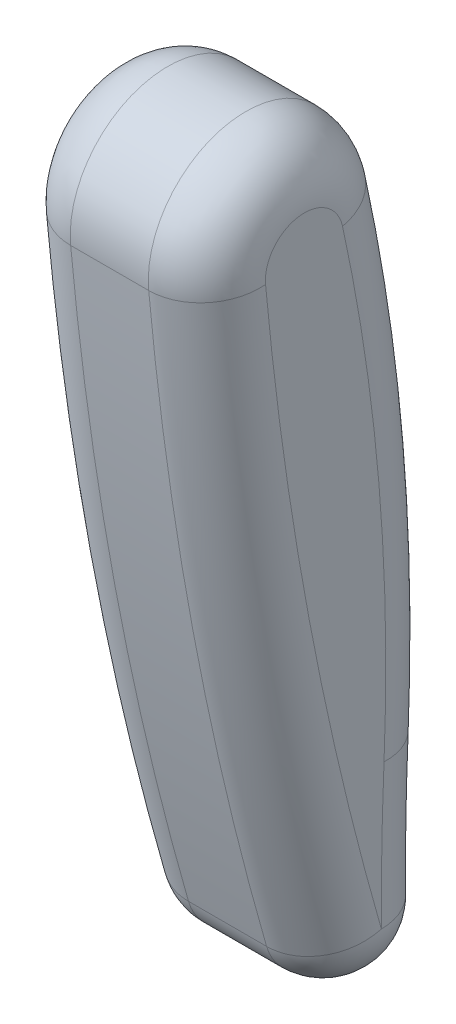
ISO-10303-21;
HEADER;
FILE_DESCRIPTION(('STEP AP214'),'2;1');
FILE_NAME('part.step','',(''),(''),'','','');
FILE_SCHEMA(('AUTOMOTIVE_DESIGN { 1 0 10303 214 1 1 1 1 }'));
ENDSEC;
DATA;
#1=APPLICATION_CONTEXT('core data for automotive mechanical design processes');
#2=APPLICATION_PROTOCOL_DEFINITION('international standard','automotive_design',2000,#1);
#3=PRODUCT_CONTEXT('',#1,'mechanical');
#4=PRODUCT('Part','Part','',(#3));
#5=PRODUCT_RELATED_PRODUCT_CATEGORY('part','',(#4));
#6=PRODUCT_DEFINITION_FORMATION('','',#4);
#7=PRODUCT_DEFINITION_CONTEXT('part definition',#1,'design');
#8=PRODUCT_DEFINITION('design','',#6,#7);
#9=PRODUCT_DEFINITION_SHAPE('','',#8);
#10=(LENGTH_UNIT() NAMED_UNIT(*) SI_UNIT(.MILLI.,.METRE.));
#11=(NAMED_UNIT(*) PLANE_ANGLE_UNIT() SI_UNIT($,.RADIAN.));
#12=(NAMED_UNIT(*) SI_UNIT($,.STERADIAN.) SOLID_ANGLE_UNIT());
#13=UNCERTAINTY_MEASURE_WITH_UNIT(LENGTH_MEASURE(1.E-05),#10,'distance_accuracy_value','');
#14=(GEOMETRIC_REPRESENTATION_CONTEXT(3) GLOBAL_UNCERTAINTY_ASSIGNED_CONTEXT((#13)) GLOBAL_UNIT_ASSIGNED_CONTEXT((#10,
#11,#12)) REPRESENTATION_CONTEXT('',''));
#15=CARTESIAN_POINT('',(0.,0.,0.));
#16=DIRECTION('',(0.,0.,1.));
#17=DIRECTION('',(1.,0.,0.));
#18=AXIS2_PLACEMENT_3D('',#15,#16,#17);
#19=CARTESIAN_POINT('',(177.8,-559.10903574724,-2113.11328138226));
#20=DIRECTION('',(-1.,0.,0.));
#21=DIRECTION('',(0.,0.,1.));
#22=AXIS2_PLACEMENT_3D('',#19,#20,#21);
#23=CYLINDRICAL_SURFACE('',#22,2209.8);
#24=DIRECTION('',(-1.,0.,0.));
#25=VECTOR('',#24,1.);
#26=CARTESIAN_POINT('',(177.8,-761.528986098875,87.3962513622892));
#27=LINE('',#26,#25);
#28=CARTESIAN_POINT('',(139.7,-761.528986098875,87.3962513622892));
#29=VERTEX_POINT('',#28);
#30=CARTESIAN_POINT('',(88.9,-761.528986098875,87.3962513622892));
#31=VERTEX_POINT('',#30);
#32=EDGE_CURVE('E182',#29,#31,#27,.T.);
#33=ORIENTED_EDGE('',*,*,#32,.T.);
#34=CARTESIAN_POINT('',(88.9,-559.10903574724,-2113.11328138226));
#35=DIRECTION('',(-1.,0.,0.));
#36=DIRECTION('',(0.,0.,1.));
#37=AXIS2_PLACEMENT_3D('',#34,#35,#36);
#38=CIRCLE('',#37,2209.8);
#39=CARTESIAN_POINT('',(88.9,-1169.53967872684,10.7017929854443));
#40=VERTEX_POINT('',#39);
#41=EDGE_CURVE('E163',#31,#40,#38,.F.);
#42=ORIENTED_EDGE('',*,*,#41,.T.);
#43=DIRECTION('',(-1.,0.,0.));
#44=VECTOR('',#43,1.);
#45=CARTESIAN_POINT('',(177.8,-1169.53967872684,10.7017929854443));
#46=LINE('',#45,#44);
#47=CARTESIAN_POINT('',(139.7,-1169.53967872684,10.7017929854443));
#48=VERTEX_POINT('',#47);
#49=EDGE_CURVE('E127',#48,#40,#46,.T.);
#50=ORIENTED_EDGE('',*,*,#49,.F.);
#51=CARTESIAN_POINT('',(139.7,-559.10903574724,-2113.11328138226));
#52=DIRECTION('',(-1.,0.,0.));
#53=DIRECTION('',(0.,0.,1.));
#54=AXIS2_PLACEMENT_3D('',#51,#52,#53);
#55=CIRCLE('',#54,2209.8);
#56=EDGE_CURVE('E161',#48,#29,#55,.T.);
#57=ORIENTED_EDGE('',*,*,#56,.T.);
#58=EDGE_LOOP('',(#33,#42,#50,#57));
#59=FACE_BOUND('',#58,.T.);
#60=ADVANCED_FACE('F35',(#59),#23,.T.);
#61=CARTESIAN_POINT('',(177.8,-1159.01501246857,-25.9157082967632));
#62=DIRECTION('',(-1.,0.,0.));
#63=DIRECTION('',(0.,0.,1.));
#64=AXIS2_PLACEMENT_3D('',#61,#62,#63);
#65=CYLINDRICAL_SURFACE('',#64,38.100000000006);
#66=ORIENTED_EDGE('',*,*,#49,.T.);
#67=CARTESIAN_POINT('',(88.9,-1159.01501246857,-25.9157082967632));
#68=DIRECTION('',(-1.,0.,0.));
#69=DIRECTION('',(0.,0.,1.));
#70=AXIS2_PLACEMENT_3D('',#67,#68,#69);
#71=CIRCLE('',#70,38.100000000006);
#72=CARTESIAN_POINT('',(88.9,-1158.77775860236,-64.01496958361));
#73=VERTEX_POINT('',#72);
#74=EDGE_CURVE('E117',#40,#73,#71,.F.);
#75=ORIENTED_EDGE('',*,*,#74,.T.);
#76=DIRECTION('',(-1.,0.,0.));
#77=VECTOR('',#76,1.);
#78=CARTESIAN_POINT('',(177.8,-1158.77775860236,-64.01496958361));
#79=LINE('',#78,#77);
#80=CARTESIAN_POINT('',(139.7,-1158.77775860236,-64.01496958361));
#81=VERTEX_POINT('',#80);
#82=EDGE_CURVE('E110',#81,#73,#79,.T.);
#83=ORIENTED_EDGE('',*,*,#82,.F.);
#84=CARTESIAN_POINT('',(139.7,-1159.01501246857,-25.9157082967632));
#85=DIRECTION('',(-1.,0.,0.));
#86=DIRECTION('',(0.,0.,1.));
#87=AXIS2_PLACEMENT_3D('',#84,#85,#86);
#88=CIRCLE('',#87,38.100000000006);
#89=EDGE_CURVE('E124',#81,#48,#88,.T.);
#90=ORIENTED_EDGE('',*,*,#89,.T.);
#91=EDGE_LOOP('',(#66,#75,#83,#90));
#92=FACE_BOUND('',#91,.T.);
#93=ADVANCED_FACE('F122',(#92),#65,.T.);
#94=CARTESIAN_POINT('',(177.8,-1147.29470222544,-1908.01427826088));
#95=DIRECTION('',(-1.,0.,0.));
#96=DIRECTION('',(0.,0.,1.));
#97=AXIS2_PLACEMENT_3D('',#94,#95,#96);
#98=CYLINDRICAL_SURFACE('',#97,1844.03506229844);
#99=ORIENTED_EDGE('',*,*,#82,.T.);
#100=CARTESIAN_POINT('',(88.9,-1147.29470222544,-1908.01427826088));
#101=DIRECTION('',(-1.,0.,0.));
#102=DIRECTION('',(0.,0.,1.));
#103=AXIS2_PLACEMENT_3D('',#100,#101,#102);
#104=CIRCLE('',#103,1844.03506229844);
#105=CARTESIAN_POINT('',(88.9,-1067.28642691419,-65.7157175309082));
#106=VERTEX_POINT('',#105);
#107=EDGE_CURVE('E116',#73,#106,#104,.T.);
#108=ORIENTED_EDGE('',*,*,#107,.T.);
#109=DIRECTION('',(-1.,0.,0.));
#110=VECTOR('',#109,1.);
#111=CARTESIAN_POINT('',(177.8,-1067.28642691419,-65.7157175309082));
#112=LINE('',#111,#110);
#113=CARTESIAN_POINT('',(139.7,-1067.28642691419,-65.7157175309082));
#114=VERTEX_POINT('',#113);
#115=EDGE_CURVE('E112',#114,#106,#112,.T.);
#116=ORIENTED_EDGE('',*,*,#115,.F.);
#117=CARTESIAN_POINT('',(139.7,-1147.29470222544,-1908.01427826088));
#118=DIRECTION('',(-1.,0.,0.));
#119=DIRECTION('',(0.,0.,1.));
#120=AXIS2_PLACEMENT_3D('',#117,#118,#119);
#121=CIRCLE('',#120,1844.03506229844);
#122=EDGE_CURVE('E107',#114,#81,#121,.F.);
#123=ORIENTED_EDGE('',*,*,#122,.T.);
#124=EDGE_LOOP('',(#99,#108,#116,#123));
#125=FACE_BOUND('',#124,.T.);
#126=ADVANCED_FACE('F109',(#125),#98,.F.);
#127=CARTESIAN_POINT('',(177.8,-1012.18416138642,1203.08834154745));
#128=DIRECTION('',(-1.,0.,0.));
#129=DIRECTION('',(0.,0.,1.));
#130=AXIS2_PLACEMENT_3D('',#127,#128,#129);
#131=CYLINDRICAL_SURFACE('',#130,1270.);
#132=ORIENTED_EDGE('',*,*,#115,.T.);
#133=CARTESIAN_POINT('',(88.9,-1012.18416138642,1203.08834154745));
#134=DIRECTION('',(-1.,0.,0.));
#135=DIRECTION('',(0.,0.,1.));
#136=AXIS2_PLACEMENT_3D('',#133,#134,#135);
#137=CIRCLE('',#136,1270.);
#138=CARTESIAN_POINT('',(88.9,-742.213802936383,-37.8854718581223));
#139=VERTEX_POINT('',#138);
#140=EDGE_CURVE('E154',#106,#139,#137,.F.);
#141=ORIENTED_EDGE('',*,*,#140,.T.);
#142=DIRECTION('',(-1.,0.,0.));
#143=VECTOR('',#142,1.);
#144=CARTESIAN_POINT('',(177.8,-742.213802936383,-37.8854718581223));
#145=LINE('',#144,#143);
#146=CARTESIAN_POINT('',(139.7,-742.213802936383,-37.8854718581223));
#147=VERTEX_POINT('',#146);
#148=EDGE_CURVE('E208',#147,#139,#145,.T.);
#149=ORIENTED_EDGE('',*,*,#148,.F.);
#150=CARTESIAN_POINT('',(139.7,-1012.18416138642,1203.08834154745));
#151=DIRECTION('',(-1.,0.,0.));
#152=DIRECTION('',(0.,0.,1.));
#153=AXIS2_PLACEMENT_3D('',#150,#151,#152);
#154=CIRCLE('',#153,1270.);
#155=EDGE_CURVE('E152',#147,#114,#154,.T.);
#156=ORIENTED_EDGE('',*,*,#155,.T.);
#157=EDGE_LOOP('',(#132,#141,#149,#156));
#158=FACE_BOUND('',#157,.T.);
#159=ADVANCED_FACE('F214',(#158),#131,.T.);
#160=CARTESIAN_POINT('',(177.8,-755.712320858886,24.1632188121575));
#161=DIRECTION('',(-1.,0.,0.));
#162=DIRECTION('',(0.,0.,1.));
#163=AXIS2_PLACEMENT_3D('',#160,#161,#162);
#164=CYLINDRICAL_SURFACE('',#163,63.5000000000009);
#165=ORIENTED_EDGE('',*,*,#148,.T.);
#166=CARTESIAN_POINT('',(88.9,-755.712320858886,24.1632188121575));
#167=DIRECTION('',(-1.,0.,0.));
#168=DIRECTION('',(0.,0.,1.));
#169=AXIS2_PLACEMENT_3D('',#166,#167,#168);
#170=CIRCLE('',#169,63.5000000000009);
#171=EDGE_CURVE('E159',#139,#31,#170,.F.);
#172=ORIENTED_EDGE('',*,*,#171,.T.);
#173=ORIENTED_EDGE('',*,*,#32,.F.);
#174=CARTESIAN_POINT('',(139.7,-755.712320858886,24.1632188121575));
#175=DIRECTION('',(-1.,0.,0.));
#176=DIRECTION('',(0.,0.,1.));
#177=AXIS2_PLACEMENT_3D('',#174,#175,#176);
#178=CIRCLE('',#177,63.5000000000009);
#179=EDGE_CURVE('E156',#29,#147,#178,.T.);
#180=ORIENTED_EDGE('',*,*,#179,.T.);
#181=EDGE_LOOP('',(#165,#172,#173,#180));
#182=FACE_BOUND('',#181,.T.);
#183=ADVANCED_FACE('F205',(#182),#164,.T.);
#184=CARTESIAN_POINT('',(177.8,-657.410678303063,-1044.47503128505));
#185=DIRECTION('',(-1.,0.,0.));
#186=DIRECTION('',(0.,0.,1.));
#187=AXIS2_PLACEMENT_3D('',#184,#185,#186);
#188=PLANE('',#187);
#189=CARTESIAN_POINT('',(177.8,-1012.18416138642,1203.08834154745));
#190=DIRECTION('',(-1.,0.,0.));
#191=DIRECTION('',(0.,0.,1.));
#192=AXIS2_PLACEMENT_3D('',#189,#190,#191);
#193=CIRCLE('',#192,1231.9);
#194=CARTESIAN_POINT('',(177.8,-1065.63335894836,-27.6515957585574));
#195=VERTEX_POINT('',#194);
#196=CARTESIAN_POINT('',(177.8,-750.312913689884,-0.656257455955195));
#197=VERTEX_POINT('',#196);
#198=EDGE_CURVE('E44',#195,#197,#193,.F.);
#199=ORIENTED_EDGE('',*,*,#198,.T.);
#200=CARTESIAN_POINT('',(177.8,-755.712320858886,24.1632188121575));
#201=DIRECTION('',(-1.,0.,0.));
#202=DIRECTION('',(0.,0.,1.));
#203=AXIS2_PLACEMENT_3D('',#200,#201,#202);
#204=CIRCLE('',#203,25.4000000000009);
#205=CARTESIAN_POINT('',(177.8,-758.038986954881,49.4564318322107));
#206=VERTEX_POINT('',#205);
#207=EDGE_CURVE('E11',#197,#206,#204,.F.);
#208=ORIENTED_EDGE('',*,*,#207,.T.);
#209=CARTESIAN_POINT('',(177.8,-559.10903574724,-2113.11328138226));
#210=DIRECTION('',(-1.,0.,0.));
#211=DIRECTION('',(0.,0.,1.));
#212=AXIS2_PLACEMENT_3D('',#209,#210,#211);
#213=CIRCLE('',#212,2171.7);
#214=CARTESIAN_POINT('',(177.8,-1159.01501246858,-25.9157082967568));
#215=VERTEX_POINT('',#214);
#216=EDGE_CURVE('E165',#206,#215,#213,.F.);
#217=ORIENTED_EDGE('',*,*,#216,.T.);
#218=CARTESIAN_POINT('',(177.8,-1147.29470222544,-1908.01427826088));
#219=DIRECTION('',(-1.,0.,0.));
#220=DIRECTION('',(0.,0.,1.));
#221=AXIS2_PLACEMENT_3D('',#218,#219,#220);
#222=CIRCLE('',#221,1882.13506229844);
#223=EDGE_CURVE('E55',#215,#195,#222,.T.);
#224=ORIENTED_EDGE('',*,*,#223,.T.);
#225=EDGE_LOOP('',(#199,#208,#217,#224));
#226=FACE_BOUND('',#225,.T.);
#227=ADVANCED_FACE('F196',(#226),#188,.F.);
#228=CARTESIAN_POINT('',(50.8,-657.410678303063,-1044.47503128505));
#229=DIRECTION('',(-1.,0.,0.));
#230=DIRECTION('',(0.,0.,1.));
#231=AXIS2_PLACEMENT_3D('',#228,#229,#230);
#232=PLANE('',#231);
#233=CARTESIAN_POINT('',(50.8,-1012.18416138642,1203.08834154745));
#234=DIRECTION('',(-1.,0.,0.));
#235=DIRECTION('',(0.,0.,1.));
#236=AXIS2_PLACEMENT_3D('',#233,#234,#235);
#237=CIRCLE('',#236,1231.9);
#238=CARTESIAN_POINT('',(50.8,-750.312913689885,-0.656257455954761));
#239=VERTEX_POINT('',#238);
#240=CARTESIAN_POINT('',(50.8,-1065.63335894836,-27.6515957585574));
#241=VERTEX_POINT('',#240);
#242=EDGE_CURVE('E147',#239,#241,#237,.T.);
#243=ORIENTED_EDGE('',*,*,#242,.T.);
#244=CARTESIAN_POINT('',(50.8,-1147.29470222544,-1908.01427826088));
#245=DIRECTION('',(-1.,0.,0.));
#246=DIRECTION('',(0.,0.,1.));
#247=AXIS2_PLACEMENT_3D('',#244,#245,#246);
#248=CIRCLE('',#247,1882.13506229844);
#249=CARTESIAN_POINT('',(50.8,-1159.01501246858,-25.9157082967568));
#250=VERTEX_POINT('',#249);
#251=EDGE_CURVE('E149',#241,#250,#248,.F.);
#252=ORIENTED_EDGE('',*,*,#251,.T.);
#253=CARTESIAN_POINT('',(50.8,-559.10903574724,-2113.11328138226));
#254=DIRECTION('',(-1.,0.,0.));
#255=DIRECTION('',(0.,0.,1.));
#256=AXIS2_PLACEMENT_3D('',#253,#254,#255);
#257=CIRCLE('',#256,2171.7);
#258=CARTESIAN_POINT('',(50.8,-758.038986954881,49.4564318322107));
#259=VERTEX_POINT('',#258);
#260=EDGE_CURVE('E143',#250,#259,#257,.T.);
#261=ORIENTED_EDGE('',*,*,#260,.T.);
#262=CARTESIAN_POINT('',(50.8,-755.712320858886,24.1632188121575));
#263=DIRECTION('',(-1.,0.,0.));
#264=DIRECTION('',(0.,0.,1.));
#265=AXIS2_PLACEMENT_3D('',#262,#263,#264);
#266=CIRCLE('',#265,25.4000000000009);
#267=EDGE_CURVE('E145',#259,#239,#266,.T.);
#268=ORIENTED_EDGE('',*,*,#267,.T.);
#269=EDGE_LOOP('',(#243,#252,#261,#268));
#270=FACE_BOUND('',#269,.T.);
#271=ADVANCED_FACE('F225',(#270),#232,.T.);
#272=CARTESIAN_POINT('',(88.9,-755.712320858886,24.1632188121575));
#273=DIRECTION('',(-1.,0.,0.));
#274=DIRECTION('',(0.,0.,1.));
#275=AXIS2_PLACEMENT_3D('',#272,#273,#274);
#276=DEGENERATE_TOROIDAL_SURFACE('',#275,25.4000000000009,38.1,.T.);
#277=CARTESIAN_POINT('',(88.9,-758.038986954881,49.4564318322107));
#278=DIRECTION('',(0.,-0.995795788191036,-0.0916010274014102));
#279=DIRECTION('',(0.,0.0916010274014102,-0.995795788191036));
#280=AXIS2_PLACEMENT_3D('',#277,#278,#279);
#281=CIRCLE('',#280,38.1);
#282=EDGE_CURVE('E176',#31,#259,#281,.T.);
#283=ORIENTED_EDGE('',*,*,#282,.F.);
#284=ORIENTED_EDGE('',*,*,#171,.F.);
#285=CARTESIAN_POINT('',(88.9,-750.312913689885,-0.656257455954761));
#286=DIRECTION('',(0.,-0.977144734965014,-0.21257508539373));
#287=DIRECTION('',(0.,0.21257508539373,-0.977144734965015));
#288=AXIS2_PLACEMENT_3D('',#285,#286,#287);
#289=CIRCLE('',#288,38.1);
#290=EDGE_CURVE('E179',#239,#139,#289,.T.);
#291=ORIENTED_EDGE('',*,*,#290,.F.);
#292=ORIENTED_EDGE('',*,*,#267,.F.);
#293=EDGE_LOOP('',(#283,#284,#291,#292));
#294=FACE_BOUND('',#293,.T.);
#295=ADVANCED_FACE('F229',(#294),#276,.T.);
#296=CARTESIAN_POINT('',(88.9,-1012.18416138642,1203.08834154745));
#297=DIRECTION('',(-1.,0.,0.));
#298=DIRECTION('',(0.,0.,1.));
#299=AXIS2_PLACEMENT_3D('',#296,#297,#298);
#300=TOROIDAL_SURFACE('',#299,1231.9,38.1);
#301=ORIENTED_EDGE('',*,*,#290,.T.);
#302=ORIENTED_EDGE('',*,*,#140,.F.);
#303=CARTESIAN_POINT('',(88.9,-1065.63335894836,-27.6515957585574));
#304=DIRECTION('',(0.,-0.999058314234924,0.0433876106517868));
#305=DIRECTION('',(0.,-0.0433876106517868,-0.999058314234924));
#306=AXIS2_PLACEMENT_3D('',#303,#304,#305);
#307=CIRCLE('',#306,38.1);
#308=EDGE_CURVE('E173',#241,#106,#307,.T.);
#309=ORIENTED_EDGE('',*,*,#308,.F.);
#310=ORIENTED_EDGE('',*,*,#242,.F.);
#311=EDGE_LOOP('',(#301,#302,#309,#310));
#312=FACE_BOUND('',#311,.T.);
#313=ADVANCED_FACE('F217',(#312),#300,.T.);
#314=CARTESIAN_POINT('',(88.9,-559.10903574724,-2113.11328138226));
#315=DIRECTION('',(-1.,0.,0.));
#316=DIRECTION('',(0.,0.,1.));
#317=AXIS2_PLACEMENT_3D('',#314,#315,#316);
#318=TOROIDAL_SURFACE('',#317,2171.7,38.1);
#319=ORIENTED_EDGE('',*,*,#282,.T.);
#320=ORIENTED_EDGE('',*,*,#260,.F.);
#321=CARTESIAN_POINT('',(88.9,-1159.01501246858,-25.9157082967575));
#322=DIRECTION('',(0.,-0.961089272498736,-0.276237959534619));
#323=DIRECTION('',(0.,0.276237959534619,-0.961089272498736));
#324=AXIS2_PLACEMENT_3D('',#321,#322,#323);
#325=CIRCLE('',#324,38.1);
#326=EDGE_CURVE('E170',#40,#250,#325,.T.);
#327=ORIENTED_EDGE('',*,*,#326,.F.);
#328=ORIENTED_EDGE('',*,*,#41,.F.);
#329=EDGE_LOOP('',(#319,#320,#327,#328));
#330=FACE_BOUND('',#329,.T.);
#331=ADVANCED_FACE('F233',(#330),#318,.T.);
#332=CARTESIAN_POINT('',(88.9,-1147.29470222544,-1908.01427826088));
#333=DIRECTION('',(-1.,0.,0.));
#334=DIRECTION('',(0.,0.,1.));
#335=AXIS2_PLACEMENT_3D('',#332,#333,#334);
#336=TOROIDAL_SURFACE('',#335,1882.13506229844,38.1);
#337=ORIENTED_EDGE('',*,*,#308,.T.);
#338=ORIENTED_EDGE('',*,*,#107,.F.);
#339=CARTESIAN_POINT('',(88.9,-1159.01501246857,-25.9157082967687));
#340=DIRECTION('',(0.,-0.999980611203171,-0.00622713559611798));
#341=DIRECTION('',(0.,0.00622713559611798,-0.999980611203171));
#342=AXIS2_PLACEMENT_3D('',#339,#340,#341);
#343=CIRCLE('',#342,38.1);
#344=EDGE_CURVE('E133',#250,#73,#343,.T.);
#345=ORIENTED_EDGE('',*,*,#344,.F.);
#346=ORIENTED_EDGE('',*,*,#251,.F.);
#347=EDGE_LOOP('',(#337,#338,#345,#346));
#348=FACE_BOUND('',#347,.T.);
#349=ADVANCED_FACE('F223',(#348),#336,.T.);
#350=CARTESIAN_POINT('',(88.9,-1159.01501246857,-25.9157082967632));
#351=DIRECTION('',(0.,0.,1.));
#352=DIRECTION('',(1.,0.,0.));
#353=AXIS2_PLACEMENT_3D('',#350,#351,#352);
#354=SPHERICAL_SURFACE('',#353,38.1);
#355=ORIENTED_EDGE('',*,*,#74,.F.);
#356=ORIENTED_EDGE('',*,*,#326,.T.);
#357=ORIENTED_EDGE('',*,*,#344,.T.);
#358=EDGE_LOOP('',(#355,#356,#357));
#359=FACE_BOUND('',#358,.T.);
#360=ADVANCED_FACE('F235',(#359),#354,.T.);
#361=CARTESIAN_POINT('',(139.7,-1147.29470222544,-1908.01427826088));
#362=DIRECTION('',(-1.,0.,0.));
#363=DIRECTION('',(0.,0.,1.));
#364=AXIS2_PLACEMENT_3D('',#361,#362,#363);
#365=TOROIDAL_SURFACE('',#364,1882.13506229844,38.1);
#366=CARTESIAN_POINT('',(139.7,-1159.01501246857,-25.9157082967687));
#367=DIRECTION('',(0.,-0.999980611203171,-0.00622713559611215));
#368=DIRECTION('',(0.,0.00622713559611215,-0.999980611203171));
#369=AXIS2_PLACEMENT_3D('',#366,#367,#368);
#370=CIRCLE('',#369,38.1);
#371=EDGE_CURVE('E39',#81,#215,#370,.T.);
#372=ORIENTED_EDGE('',*,*,#371,.F.);
#373=ORIENTED_EDGE('',*,*,#122,.F.);
#374=CARTESIAN_POINT('',(139.7,-1065.63335894836,-27.6515957585574));
#375=DIRECTION('',(0.,0.999058314234924,-0.0433876106517868));
#376=DIRECTION('',(0.,0.0433876106517868,0.999058314234925));
#377=AXIS2_PLACEMENT_3D('',#374,#375,#376);
#378=CIRCLE('',#377,38.1);
#379=EDGE_CURVE('E134',#195,#114,#378,.T.);
#380=ORIENTED_EDGE('',*,*,#379,.F.);
#381=ORIENTED_EDGE('',*,*,#223,.F.);
#382=EDGE_LOOP('',(#372,#373,#380,#381));
#383=FACE_BOUND('',#382,.T.);
#384=ADVANCED_FACE('F37',(#383),#365,.T.);
#385=CARTESIAN_POINT('',(139.7,-1159.01501246857,-25.9157082967632));
#386=DIRECTION('',(0.,0.,1.));
#387=DIRECTION('',(1.,0.,0.));
#388=AXIS2_PLACEMENT_3D('',#385,#386,#387);
#389=SPHERICAL_SURFACE('',#388,38.1);
#390=ORIENTED_EDGE('',*,*,#89,.F.);
#391=ORIENTED_EDGE('',*,*,#371,.T.);
#392=CARTESIAN_POINT('',(139.7,-1159.01501246858,-25.9157082967574));
#393=DIRECTION('',(0.,0.961089272498733,0.27623795953463));
#394=DIRECTION('',(0.,-0.27623795953463,0.961089272498733));
#395=AXIS2_PLACEMENT_3D('',#392,#393,#394);
#396=CIRCLE('',#395,38.1);
#397=EDGE_CURVE('E136',#48,#215,#396,.T.);
#398=ORIENTED_EDGE('',*,*,#397,.F.);
#399=EDGE_LOOP('',(#390,#391,#398));
#400=FACE_BOUND('',#399,.T.);
#401=ADVANCED_FACE('F135',(#400),#389,.T.);
#402=CARTESIAN_POINT('',(139.7,-1012.18416138642,1203.08834154745));
#403=DIRECTION('',(-1.,0.,0.));
#404=DIRECTION('',(0.,0.,1.));
#405=AXIS2_PLACEMENT_3D('',#402,#403,#404);
#406=TOROIDAL_SURFACE('',#405,1231.9,38.1);
#407=ORIENTED_EDGE('',*,*,#379,.T.);
#408=ORIENTED_EDGE('',*,*,#155,.F.);
#409=CARTESIAN_POINT('',(139.7,-750.312913689884,-0.656257455955195));
#410=DIRECTION('',(0.,0.977144734965014,0.21257508539373));
#411=DIRECTION('',(0.,-0.21257508539373,0.977144734965015));
#412=AXIS2_PLACEMENT_3D('',#409,#410,#411);
#413=CIRCLE('',#412,38.1);
#414=EDGE_CURVE('E185',#197,#147,#413,.T.);
#415=ORIENTED_EDGE('',*,*,#414,.F.);
#416=ORIENTED_EDGE('',*,*,#198,.F.);
#417=EDGE_LOOP('',(#407,#408,#415,#416));
#418=FACE_BOUND('',#417,.T.);
#419=ADVANCED_FACE('F189',(#418),#406,.T.);
#420=CARTESIAN_POINT('',(139.7,-559.10903574724,-2113.11328138226));
#421=DIRECTION('',(-1.,0.,0.));
#422=DIRECTION('',(0.,0.,1.));
#423=AXIS2_PLACEMENT_3D('',#420,#421,#422);
#424=TOROIDAL_SURFACE('',#423,2171.7,38.1);
#425=ORIENTED_EDGE('',*,*,#397,.T.);
#426=ORIENTED_EDGE('',*,*,#216,.F.);
#427=CARTESIAN_POINT('',(139.7,-758.038986954881,49.4564318322107));
#428=DIRECTION('',(0.,0.995795788191036,0.0916010274014102));
#429=DIRECTION('',(0.,-0.0916010274014102,0.995795788191036));
#430=AXIS2_PLACEMENT_3D('',#427,#428,#429);
#431=CIRCLE('',#430,38.1);
#432=EDGE_CURVE('E183',#29,#206,#431,.T.);
#433=ORIENTED_EDGE('',*,*,#432,.F.);
#434=ORIENTED_EDGE('',*,*,#56,.F.);
#435=EDGE_LOOP('',(#425,#426,#433,#434));
#436=FACE_BOUND('',#435,.T.);
#437=ADVANCED_FACE('F198',(#436),#424,.T.);
#438=CARTESIAN_POINT('',(139.7,-755.712320858886,24.1632188121575));
#439=DIRECTION('',(-1.,0.,0.));
#440=DIRECTION('',(0.,0.,1.));
#441=AXIS2_PLACEMENT_3D('',#438,#439,#440);
#442=DEGENERATE_TOROIDAL_SURFACE('',#441,25.4000000000009,38.1,.T.);
#443=ORIENTED_EDGE('',*,*,#414,.T.);
#444=ORIENTED_EDGE('',*,*,#179,.F.);
#445=ORIENTED_EDGE('',*,*,#432,.T.);
#446=ORIENTED_EDGE('',*,*,#207,.F.);
#447=EDGE_LOOP('',(#443,#444,#445,#446));
#448=FACE_BOUND('',#447,.T.);
#449=ADVANCED_FACE('F193',(#448),#442,.T.);
#450=CLOSED_SHELL('',(#60,#93,#126,#159,#183,#227,#271,#295,#313,#331,#349,#360,#384,#401,#419,
#437,#449));
#451=MANIFOLD_SOLID_BREP('B2',#450);
#452=ADVANCED_BREP_SHAPE_REPRESENTATION('',(#18,#451),#14);
#453=SHAPE_DEFINITION_REPRESENTATION(#9,#452);
ENDSEC;
END-ISO-10303-21;
